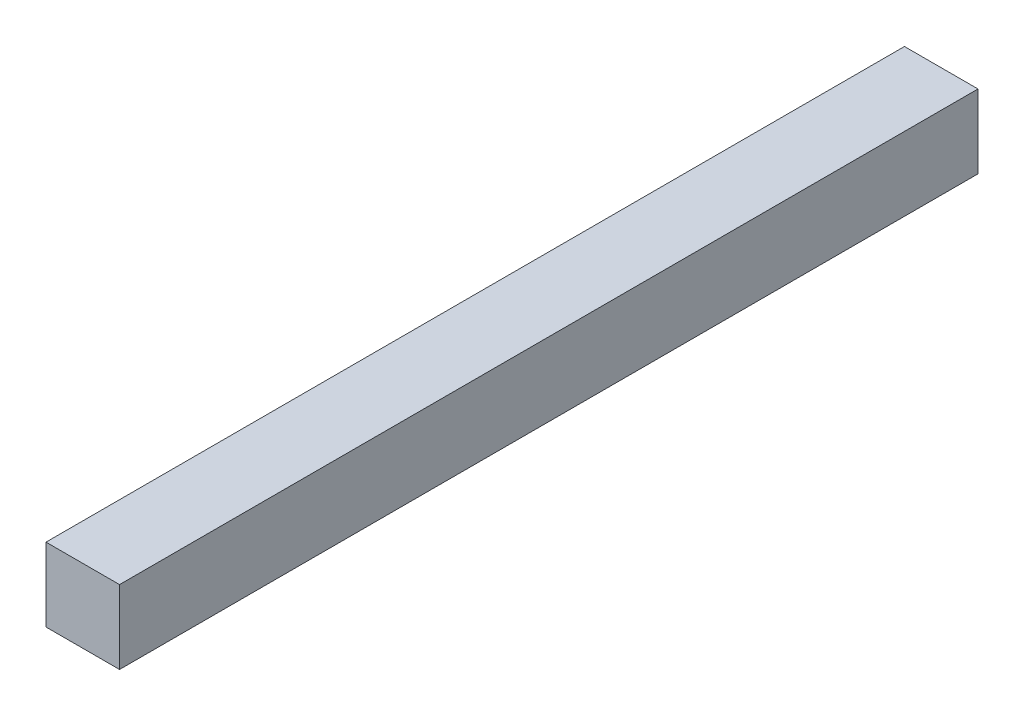
ISO-10303-21;
HEADER;
FILE_DESCRIPTION(('STEP AP214'),'2;1');
FILE_NAME('part.step','',(''),(''),'','','');
FILE_SCHEMA(('AUTOMOTIVE_DESIGN { 1 0 10303 214 1 1 1 1 }'));
ENDSEC;
DATA;
#1=APPLICATION_CONTEXT('core data for automotive mechanical design processes');
#2=APPLICATION_PROTOCOL_DEFINITION('international standard','automotive_design',2000,#1);
#3=PRODUCT_CONTEXT('',#1,'mechanical');
#4=PRODUCT('Part','Part','',(#3));
#5=PRODUCT_RELATED_PRODUCT_CATEGORY('part','',(#4));
#6=PRODUCT_DEFINITION_FORMATION('','',#4);
#7=PRODUCT_DEFINITION_CONTEXT('part definition',#1,'design');
#8=PRODUCT_DEFINITION('design','',#6,#7);
#9=PRODUCT_DEFINITION_SHAPE('','',#8);
#10=(LENGTH_UNIT() NAMED_UNIT(*) SI_UNIT(.MILLI.,.METRE.));
#11=(NAMED_UNIT(*) PLANE_ANGLE_UNIT() SI_UNIT($,.RADIAN.));
#12=(NAMED_UNIT(*) SI_UNIT($,.STERADIAN.) SOLID_ANGLE_UNIT());
#13=UNCERTAINTY_MEASURE_WITH_UNIT(LENGTH_MEASURE(1.E-05),#10,'distance_accuracy_value','');
#14=(GEOMETRIC_REPRESENTATION_CONTEXT(3) GLOBAL_UNCERTAINTY_ASSIGNED_CONTEXT((#13)) GLOBAL_UNIT_ASSIGNED_CONTEXT((#10,
#11,#12)) REPRESENTATION_CONTEXT('',''));
#15=CARTESIAN_POINT('',(0.,0.,0.));
#16=DIRECTION('',(0.,0.,1.));
#17=DIRECTION('',(1.,0.,0.));
#18=AXIS2_PLACEMENT_3D('',#15,#16,#17);
#19=CARTESIAN_POINT('',(15.,15.,175.1));
#20=DIRECTION('',(-1.,0.,0.));
#21=DIRECTION('',(0.,0.,1.));
#22=AXIS2_PLACEMENT_3D('',#19,#20,#21);
#23=PLANE('',#22);
#24=DIRECTION('',(0.,1.,0.));
#25=VECTOR('',#24,1.);
#26=CARTESIAN_POINT('',(15.,15.,-175.1));
#27=LINE('',#26,#25);
#28=CARTESIAN_POINT('',(15.,-15.,-175.1));
#29=VERTEX_POINT('',#28);
#30=CARTESIAN_POINT('',(15.,15.,-175.1));
#31=VERTEX_POINT('',#30);
#32=EDGE_CURVE('E98',#29,#31,#27,.T.);
#33=ORIENTED_EDGE('',*,*,#32,.T.);
#34=DIRECTION('',(0.,0.,-1.));
#35=VECTOR('',#34,1.);
#36=CARTESIAN_POINT('',(15.,15.,175.1));
#37=LINE('',#36,#35);
#38=CARTESIAN_POINT('',(15.,15.,175.1));
#39=VERTEX_POINT('',#38);
#40=EDGE_CURVE('E11',#39,#31,#37,.T.);
#41=ORIENTED_EDGE('',*,*,#40,.F.);
#42=DIRECTION('',(0.,1.,0.));
#43=VECTOR('',#42,1.);
#44=CARTESIAN_POINT('',(15.,15.,175.1));
#45=LINE('',#44,#43);
#46=CARTESIAN_POINT('',(15.,-15.,175.1));
#47=VERTEX_POINT('',#46);
#48=EDGE_CURVE('E86',#47,#39,#45,.T.);
#49=ORIENTED_EDGE('',*,*,#48,.F.);
#50=DIRECTION('',(0.,0.,-1.));
#51=VECTOR('',#50,1.);
#52=CARTESIAN_POINT('',(15.,-15.,175.1));
#53=LINE('',#52,#51);
#54=EDGE_CURVE('E94',#47,#29,#53,.T.);
#55=ORIENTED_EDGE('',*,*,#54,.T.);
#56=EDGE_LOOP('',(#33,#41,#49,#55));
#57=FACE_BOUND('',#56,.T.);
#58=ADVANCED_FACE('F35',(#57),#23,.F.);
#59=CARTESIAN_POINT('',(-15.,15.,175.1));
#60=DIRECTION('',(0.,-1.,0.));
#61=DIRECTION('',(0.,0.,-1.));
#62=AXIS2_PLACEMENT_3D('',#59,#60,#61);
#63=PLANE('',#62);
#64=DIRECTION('',(-1.,0.,0.));
#65=VECTOR('',#64,1.);
#66=CARTESIAN_POINT('',(-15.,15.,-175.1));
#67=LINE('',#66,#65);
#68=CARTESIAN_POINT('',(-15.,15.,-175.1));
#69=VERTEX_POINT('',#68);
#70=EDGE_CURVE('E90',#31,#69,#67,.T.);
#71=ORIENTED_EDGE('',*,*,#70,.T.);
#72=DIRECTION('',(0.,0.,-1.));
#73=VECTOR('',#72,1.);
#74=CARTESIAN_POINT('',(-15.,15.,175.1));
#75=LINE('',#74,#73);
#76=CARTESIAN_POINT('',(-15.,15.,175.1));
#77=VERTEX_POINT('',#76);
#78=EDGE_CURVE('E43',#77,#69,#75,.T.);
#79=ORIENTED_EDGE('',*,*,#78,.F.);
#80=DIRECTION('',(-1.,0.,0.));
#81=VECTOR('',#80,1.);
#82=CARTESIAN_POINT('',(-15.,15.,175.1));
#83=LINE('',#82,#81);
#84=EDGE_CURVE('E81',#39,#77,#83,.T.);
#85=ORIENTED_EDGE('',*,*,#84,.F.);
#86=ORIENTED_EDGE('',*,*,#40,.T.);
#87=EDGE_LOOP('',(#71,#79,#85,#86));
#88=FACE_BOUND('',#87,.T.);
#89=ADVANCED_FACE('F89',(#88),#63,.F.);
#90=CARTESIAN_POINT('',(-15.,15.,175.1));
#91=DIRECTION('',(1.,0.,0.));
#92=DIRECTION('',(0.,0.,-1.));
#93=AXIS2_PLACEMENT_3D('',#90,#91,#92);
#94=PLANE('',#93);
#95=DIRECTION('',(0.,-1.,0.));
#96=VECTOR('',#95,1.);
#97=CARTESIAN_POINT('',(-15.,15.,-175.1));
#98=LINE('',#97,#96);
#99=CARTESIAN_POINT('',(-15.,-15.,-175.1));
#100=VERTEX_POINT('',#99);
#101=EDGE_CURVE('E68',#69,#100,#98,.T.);
#102=ORIENTED_EDGE('',*,*,#101,.T.);
#103=DIRECTION('',(0.,0.,-1.));
#104=VECTOR('',#103,1.);
#105=CARTESIAN_POINT('',(-15.,-15.,175.1));
#106=LINE('',#105,#104);
#107=CARTESIAN_POINT('',(-15.,-15.,175.1));
#108=VERTEX_POINT('',#107);
#109=EDGE_CURVE('E91',#108,#100,#106,.T.);
#110=ORIENTED_EDGE('',*,*,#109,.F.);
#111=DIRECTION('',(0.,-1.,0.));
#112=VECTOR('',#111,1.);
#113=CARTESIAN_POINT('',(-15.,15.,175.1));
#114=LINE('',#113,#112);
#115=EDGE_CURVE('E84',#77,#108,#114,.T.);
#116=ORIENTED_EDGE('',*,*,#115,.F.);
#117=ORIENTED_EDGE('',*,*,#78,.T.);
#118=EDGE_LOOP('',(#102,#110,#116,#117));
#119=FACE_BOUND('',#118,.T.);
#120=ADVANCED_FACE('F92',(#119),#94,.F.);
#121=CARTESIAN_POINT('',(-15.,-15.,175.1));
#122=DIRECTION('',(0.,1.,0.));
#123=DIRECTION('',(0.,0.,1.));
#124=AXIS2_PLACEMENT_3D('',#121,#122,#123);
#125=PLANE('',#124);
#126=DIRECTION('',(1.,0.,0.));
#127=VECTOR('',#126,1.);
#128=CARTESIAN_POINT('',(-15.,-15.,-175.1));
#129=LINE('',#128,#127);
#130=EDGE_CURVE('E74',#100,#29,#129,.T.);
#131=ORIENTED_EDGE('',*,*,#130,.T.);
#132=ORIENTED_EDGE('',*,*,#54,.F.);
#133=DIRECTION('',(1.,0.,0.));
#134=VECTOR('',#133,1.);
#135=CARTESIAN_POINT('',(-15.,-15.,175.1));
#136=LINE('',#135,#134);
#137=EDGE_CURVE('E51',#108,#47,#136,.T.);
#138=ORIENTED_EDGE('',*,*,#137,.F.);
#139=ORIENTED_EDGE('',*,*,#109,.T.);
#140=EDGE_LOOP('',(#131,#132,#138,#139));
#141=FACE_BOUND('',#140,.T.);
#142=ADVANCED_FACE('F105',(#141),#125,.F.);
#143=CARTESIAN_POINT('',(0.,0.,175.1));
#144=DIRECTION('',(0.,0.,1.));
#145=DIRECTION('',(1.,0.,0.));
#146=AXIS2_PLACEMENT_3D('',#143,#144,#145);
#147=PLANE('',#146);
#148=ORIENTED_EDGE('',*,*,#48,.T.);
#149=ORIENTED_EDGE('',*,*,#84,.T.);
#150=ORIENTED_EDGE('',*,*,#115,.T.);
#151=ORIENTED_EDGE('',*,*,#137,.T.);
#152=EDGE_LOOP('',(#148,#149,#150,#151));
#153=FACE_BOUND('',#152,.T.);
#154=ADVANCED_FACE('F82',(#153),#147,.T.);
#155=CARTESIAN_POINT('',(0.,0.,-175.1));
#156=DIRECTION('',(0.,0.,1.));
#157=DIRECTION('',(1.,0.,0.));
#158=AXIS2_PLACEMENT_3D('',#155,#156,#157);
#159=PLANE('',#158);
#160=ORIENTED_EDGE('',*,*,#32,.F.);
#161=ORIENTED_EDGE('',*,*,#130,.F.);
#162=ORIENTED_EDGE('',*,*,#101,.F.);
#163=ORIENTED_EDGE('',*,*,#70,.F.);
#164=EDGE_LOOP('',(#160,#161,#162,#163));
#165=FACE_BOUND('',#164,.T.);
#166=ADVANCED_FACE('F108',(#165),#159,.F.);
#167=CLOSED_SHELL('',(#58,#89,#120,#142,#154,#166));
#168=MANIFOLD_SOLID_BREP('B2',#167);
#169=ADVANCED_BREP_SHAPE_REPRESENTATION('',(#18,#168),#14);
#170=SHAPE_DEFINITION_REPRESENTATION(#9,#169);
ENDSEC;
END-ISO-10303-21;
